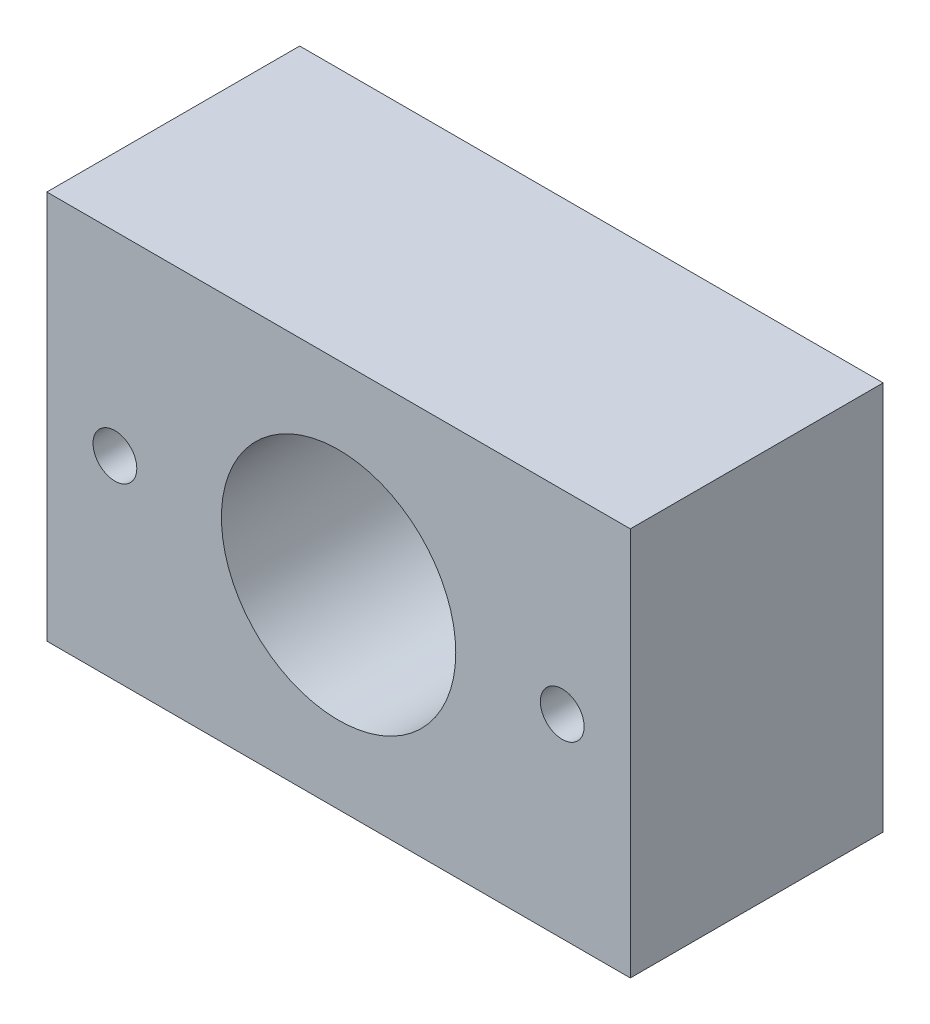
ISO-10303-21;
HEADER;
FILE_DESCRIPTION(('STEP AP214'),'2;1');
FILE_NAME('part.step','',(''),(''),'','','');
FILE_SCHEMA(('AUTOMOTIVE_DESIGN { 1 0 10303 214 1 1 1 1 }'));
ENDSEC;
DATA;
#1=APPLICATION_CONTEXT('core data for automotive mechanical design processes');
#2=APPLICATION_PROTOCOL_DEFINITION('international standard','automotive_design',2000,#1);
#3=PRODUCT_CONTEXT('',#1,'mechanical');
#4=PRODUCT('Part','Part','',(#3));
#5=PRODUCT_RELATED_PRODUCT_CATEGORY('part','',(#4));
#6=PRODUCT_DEFINITION_FORMATION('','',#4);
#7=PRODUCT_DEFINITION_CONTEXT('part definition',#1,'design');
#8=PRODUCT_DEFINITION('design','',#6,#7);
#9=PRODUCT_DEFINITION_SHAPE('','',#8);
#10=(LENGTH_UNIT() NAMED_UNIT(*) SI_UNIT(.MILLI.,.METRE.));
#11=(NAMED_UNIT(*) PLANE_ANGLE_UNIT() SI_UNIT($,.RADIAN.));
#12=(NAMED_UNIT(*) SI_UNIT($,.STERADIAN.) SOLID_ANGLE_UNIT());
#13=UNCERTAINTY_MEASURE_WITH_UNIT(LENGTH_MEASURE(1.E-05),#10,'distance_accuracy_value','');
#14=(GEOMETRIC_REPRESENTATION_CONTEXT(3) GLOBAL_UNCERTAINTY_ASSIGNED_CONTEXT((#13)) GLOBAL_UNIT_ASSIGNED_CONTEXT((#10,
#11,#12)) REPRESENTATION_CONTEXT('',''));
#15=CARTESIAN_POINT('',(0.,0.,0.));
#16=DIRECTION('',(0.,0.,1.));
#17=DIRECTION('',(1.,0.,0.));
#18=AXIS2_PLACEMENT_3D('',#15,#16,#17);
#19=CARTESIAN_POINT('',(0.,0.,6.));
#20=DIRECTION('',(0.,0.,1.));
#21=DIRECTION('',(1.,0.,0.));
#22=AXIS2_PLACEMENT_3D('',#19,#20,#21);
#23=PLANE('',#22);
#24=CARTESIAN_POINT('',(0.,0.,6.));
#25=DIRECTION('',(0.,0.,1.));
#26=DIRECTION('',(1.,0.,0.));
#27=AXIS2_PLACEMENT_3D('',#24,#25,#26);
#28=CIRCLE('',#27,9.51);
#29=CARTESIAN_POINT('',(9.51,0.,6.));
#30=VERTEX_POINT('',#29);
#31=EDGE_CURVE('E10',#30,#30,#28,.T.);
#32=ORIENTED_EDGE('',*,*,#31,.F.);
#33=EDGE_LOOP('',(#32));
#34=FACE_BOUND('',#33,.T.);
#35=CARTESIAN_POINT('',(0.,0.,6.));
#36=DIRECTION('',(0.,0.,1.));
#37=DIRECTION('',(1.,0.,0.));
#38=AXIS2_PLACEMENT_3D('',#35,#36,#37);
#39=CIRCLE('',#38,12.05);
#40=CARTESIAN_POINT('',(12.05,0.,6.));
#41=VERTEX_POINT('',#40);
#42=EDGE_CURVE('E20',#41,#41,#39,.T.);
#43=ORIENTED_EDGE('',*,*,#42,.T.);
#44=EDGE_LOOP('',(#43));
#45=FACE_BOUND('',#44,.T.);
#46=ADVANCED_FACE('F16',(#34,#45),#23,.T.);
#47=CARTESIAN_POINT('',(0.,0.,-1.));
#48=DIRECTION('',(0.,0.,1.));
#49=DIRECTION('',(1.,0.,0.));
#50=AXIS2_PLACEMENT_3D('',#47,#48,#49);
#51=CYLINDRICAL_SURFACE('',#50,9.51);
#52=ORIENTED_EDGE('',*,*,#31,.T.);
#53=EDGE_LOOP('',(#52));
#54=FACE_BOUND('',#53,.T.);
#55=CARTESIAN_POINT('',(0.,0.,0.));
#56=DIRECTION('',(0.,0.,1.));
#57=DIRECTION('',(1.,0.,0.));
#58=AXIS2_PLACEMENT_3D('',#55,#56,#57);
#59=CIRCLE('',#58,9.51);
#60=CARTESIAN_POINT('',(9.51,0.,0.));
#61=VERTEX_POINT('',#60);
#62=EDGE_CURVE('E115',#61,#61,#59,.T.);
#63=ORIENTED_EDGE('',*,*,#62,.F.);
#64=EDGE_LOOP('',(#63));
#65=FACE_BOUND('',#64,.T.);
#66=ADVANCED_FACE('F18',(#54,#65),#51,.F.);
#67=CARTESIAN_POINT('',(23.,0.,-1.));
#68=DIRECTION('',(0.,0.,1.));
#69=DIRECTION('',(1.,0.,0.));
#70=AXIS2_PLACEMENT_3D('',#67,#68,#69);
#71=CYLINDRICAL_SURFACE('',#70,2.25);
#72=CARTESIAN_POINT('',(23.,0.,26.));
#73=DIRECTION('',(0.,0.,1.));
#74=DIRECTION('',(1.,0.,0.));
#75=AXIS2_PLACEMENT_3D('',#72,#73,#74);
#76=CIRCLE('',#75,2.25);
#77=CARTESIAN_POINT('',(25.25,0.,26.));
#78=VERTEX_POINT('',#77);
#79=EDGE_CURVE('E94',#78,#78,#76,.T.);
#80=ORIENTED_EDGE('',*,*,#79,.T.);
#81=EDGE_LOOP('',(#80));
#82=FACE_BOUND('',#81,.T.);
#83=CARTESIAN_POINT('',(23.,0.,0.));
#84=DIRECTION('',(0.,0.,1.));
#85=DIRECTION('',(1.,0.,0.));
#86=AXIS2_PLACEMENT_3D('',#83,#84,#85);
#87=CIRCLE('',#86,2.25);
#88=CARTESIAN_POINT('',(25.25,0.,0.));
#89=VERTEX_POINT('',#88);
#90=EDGE_CURVE('E118',#89,#89,#87,.T.);
#91=ORIENTED_EDGE('',*,*,#90,.F.);
#92=EDGE_LOOP('',(#91));
#93=FACE_BOUND('',#92,.T.);
#94=ADVANCED_FACE('F134',(#82,#93),#71,.F.);
#95=CARTESIAN_POINT('',(0.,0.,6.));
#96=DIRECTION('',(0.,0.,1.));
#97=DIRECTION('',(1.,0.,0.));
#98=AXIS2_PLACEMENT_3D('',#95,#96,#97);
#99=CYLINDRICAL_SURFACE('',#98,12.05);
#100=CARTESIAN_POINT('',(0.,0.,26.));
#101=DIRECTION('',(0.,0.,1.));
#102=DIRECTION('',(1.,0.,0.));
#103=AXIS2_PLACEMENT_3D('',#100,#101,#102);
#104=CIRCLE('',#103,12.05);
#105=CARTESIAN_POINT('',(12.05,0.,26.));
#106=VERTEX_POINT('',#105);
#107=EDGE_CURVE('E102',#106,#106,#104,.T.);
#108=ORIENTED_EDGE('',*,*,#107,.T.);
#109=EDGE_LOOP('',(#108));
#110=FACE_BOUND('',#109,.T.);
#111=ORIENTED_EDGE('',*,*,#42,.F.);
#112=EDGE_LOOP('',(#111));
#113=FACE_BOUND('',#112,.T.);
#114=ADVANCED_FACE('F131',(#110,#113),#99,.F.);
#115=CARTESIAN_POINT('',(-23.,0.,-1.));
#116=DIRECTION('',(0.,0.,1.));
#117=DIRECTION('',(1.,0.,0.));
#118=AXIS2_PLACEMENT_3D('',#115,#116,#117);
#119=CYLINDRICAL_SURFACE('',#118,2.25);
#120=CARTESIAN_POINT('',(-23.,0.,26.));
#121=DIRECTION('',(0.,0.,1.));
#122=DIRECTION('',(1.,0.,0.));
#123=AXIS2_PLACEMENT_3D('',#120,#121,#122);
#124=CIRCLE('',#123,2.25);
#125=CARTESIAN_POINT('',(-20.75,0.,26.));
#126=VERTEX_POINT('',#125);
#127=EDGE_CURVE('E98',#126,#126,#124,.T.);
#128=ORIENTED_EDGE('',*,*,#127,.T.);
#129=EDGE_LOOP('',(#128));
#130=FACE_BOUND('',#129,.T.);
#131=CARTESIAN_POINT('',(-23.,0.,0.));
#132=DIRECTION('',(0.,0.,1.));
#133=DIRECTION('',(1.,0.,0.));
#134=AXIS2_PLACEMENT_3D('',#131,#132,#133);
#135=CIRCLE('',#134,2.25);
#136=CARTESIAN_POINT('',(-20.75,0.,0.));
#137=VERTEX_POINT('',#136);
#138=EDGE_CURVE('E114',#137,#137,#135,.T.);
#139=ORIENTED_EDGE('',*,*,#138,.F.);
#140=EDGE_LOOP('',(#139));
#141=FACE_BOUND('',#140,.T.);
#142=ADVANCED_FACE('F133',(#130,#141),#119,.F.);
#143=CARTESIAN_POINT('',(30.,-20.,0.));
#144=DIRECTION('',(1.,0.,0.));
#145=DIRECTION('',(0.,1.,0.));
#146=AXIS2_PLACEMENT_3D('',#143,#144,#145);
#147=PLANE('',#146);
#148=DIRECTION('',(0.,0.,1.));
#149=VECTOR('',#148,1.);
#150=CARTESIAN_POINT('',(30.,-20.,0.));
#151=LINE('',#150,#149);
#152=CARTESIAN_POINT('',(30.,-20.,0.));
#153=VERTEX_POINT('',#152);
#154=CARTESIAN_POINT('',(30.,-20.,26.));
#155=VERTEX_POINT('',#154);
#156=EDGE_CURVE('E60',#153,#155,#151,.T.);
#157=ORIENTED_EDGE('',*,*,#156,.F.);
#158=DIRECTION('',(0.,1.,0.));
#159=VECTOR('',#158,1.);
#160=CARTESIAN_POINT('',(30.,-20.,0.));
#161=LINE('',#160,#159);
#162=CARTESIAN_POINT('',(30.,20.,0.));
#163=VERTEX_POINT('',#162);
#164=EDGE_CURVE('E39',#153,#163,#161,.T.);
#165=ORIENTED_EDGE('',*,*,#164,.T.);
#166=DIRECTION('',(0.,0.,1.));
#167=VECTOR('',#166,1.);
#168=CARTESIAN_POINT('',(30.,20.,0.));
#169=LINE('',#168,#167);
#170=CARTESIAN_POINT('',(30.,20.,26.));
#171=VERTEX_POINT('',#170);
#172=EDGE_CURVE('E61',#163,#171,#169,.T.);
#173=ORIENTED_EDGE('',*,*,#172,.T.);
#174=DIRECTION('',(0.,1.,0.));
#175=VECTOR('',#174,1.);
#176=CARTESIAN_POINT('',(30.,-20.,26.));
#177=LINE('',#176,#175);
#178=EDGE_CURVE('E56',#155,#171,#177,.T.);
#179=ORIENTED_EDGE('',*,*,#178,.F.);
#180=EDGE_LOOP('',(#157,#165,#173,#179));
#181=FACE_BOUND('',#180,.T.);
#182=ADVANCED_FACE('F58',(#181),#147,.T.);
#183=CARTESIAN_POINT('',(-30.,-20.,0.));
#184=DIRECTION('',(0.,0.,1.));
#185=DIRECTION('',(1.,0.,0.));
#186=AXIS2_PLACEMENT_3D('',#183,#184,#185);
#187=PLANE('',#186);
#188=ORIENTED_EDGE('',*,*,#90,.T.);
#189=EDGE_LOOP('',(#188));
#190=FACE_BOUND('',#189,.T.);
#191=ORIENTED_EDGE('',*,*,#62,.T.);
#192=EDGE_LOOP('',(#191));
#193=FACE_BOUND('',#192,.T.);
#194=ORIENTED_EDGE('',*,*,#138,.T.);
#195=EDGE_LOOP('',(#194));
#196=FACE_BOUND('',#195,.T.);
#197=DIRECTION('',(1.,0.,0.));
#198=VECTOR('',#197,1.);
#199=CARTESIAN_POINT('',(-30.,20.,0.));
#200=LINE('',#199,#198);
#201=CARTESIAN_POINT('',(-30.,20.,0.));
#202=VERTEX_POINT('',#201);
#203=EDGE_CURVE('E106',#202,#163,#200,.T.);
#204=ORIENTED_EDGE('',*,*,#203,.T.);
#205=ORIENTED_EDGE('',*,*,#164,.F.);
#206=DIRECTION('',(1.,0.,0.));
#207=VECTOR('',#206,1.);
#208=CARTESIAN_POINT('',(-30.,-20.,0.));
#209=LINE('',#208,#207);
#210=CARTESIAN_POINT('',(-30.,-20.,0.));
#211=VERTEX_POINT('',#210);
#212=EDGE_CURVE('E67',#211,#153,#209,.T.);
#213=ORIENTED_EDGE('',*,*,#212,.F.);
#214=DIRECTION('',(0.,1.,0.));
#215=VECTOR('',#214,1.);
#216=CARTESIAN_POINT('',(-30.,-20.,0.));
#217=LINE('',#216,#215);
#218=EDGE_CURVE('E90',#211,#202,#217,.T.);
#219=ORIENTED_EDGE('',*,*,#218,.T.);
#220=EDGE_LOOP('',(#204,#205,#213,#219));
#221=FACE_BOUND('',#220,.T.);
#222=ADVANCED_FACE('F157',(#190,#193,#196,#221),#187,.F.);
#223=CARTESIAN_POINT('',(-30.,20.,0.));
#224=DIRECTION('',(0.,1.,0.));
#225=DIRECTION('',(1.,0.,0.));
#226=AXIS2_PLACEMENT_3D('',#223,#224,#225);
#227=PLANE('',#226);
#228=ORIENTED_EDGE('',*,*,#203,.F.);
#229=DIRECTION('',(0.,0.,1.));
#230=VECTOR('',#229,1.);
#231=CARTESIAN_POINT('',(-30.,20.,0.));
#232=LINE('',#231,#230);
#233=CARTESIAN_POINT('',(-30.,20.,26.));
#234=VERTEX_POINT('',#233);
#235=EDGE_CURVE('E180',#202,#234,#232,.T.);
#236=ORIENTED_EDGE('',*,*,#235,.T.);
#237=DIRECTION('',(1.,0.,0.));
#238=VECTOR('',#237,1.);
#239=CARTESIAN_POINT('',(-30.,20.,26.));
#240=LINE('',#239,#238);
#241=EDGE_CURVE('E66',#234,#171,#240,.T.);
#242=ORIENTED_EDGE('',*,*,#241,.T.);
#243=ORIENTED_EDGE('',*,*,#172,.F.);
#244=EDGE_LOOP('',(#228,#236,#242,#243));
#245=FACE_BOUND('',#244,.T.);
#246=ADVANCED_FACE('F163',(#245),#227,.T.);
#247=CARTESIAN_POINT('',(-30.,-20.,26.));
#248=DIRECTION('',(0.,0.,1.));
#249=DIRECTION('',(1.,0.,0.));
#250=AXIS2_PLACEMENT_3D('',#247,#248,#249);
#251=PLANE('',#250);
#252=ORIENTED_EDGE('',*,*,#79,.F.);
#253=EDGE_LOOP('',(#252));
#254=FACE_BOUND('',#253,.T.);
#255=ORIENTED_EDGE('',*,*,#107,.F.);
#256=EDGE_LOOP('',(#255));
#257=FACE_BOUND('',#256,.T.);
#258=ORIENTED_EDGE('',*,*,#127,.F.);
#259=EDGE_LOOP('',(#258));
#260=FACE_BOUND('',#259,.T.);
#261=DIRECTION('',(0.,1.,0.));
#262=VECTOR('',#261,1.);
#263=CARTESIAN_POINT('',(-30.,-20.,26.));
#264=LINE('',#263,#262);
#265=CARTESIAN_POINT('',(-30.,-20.,26.));
#266=VERTEX_POINT('',#265);
#267=EDGE_CURVE('E75',#266,#234,#264,.T.);
#268=ORIENTED_EDGE('',*,*,#267,.F.);
#269=DIRECTION('',(1.,0.,0.));
#270=VECTOR('',#269,1.);
#271=CARTESIAN_POINT('',(-30.,-20.,26.));
#272=LINE('',#271,#270);
#273=EDGE_CURVE('E71',#266,#155,#272,.T.);
#274=ORIENTED_EDGE('',*,*,#273,.T.);
#275=ORIENTED_EDGE('',*,*,#178,.T.);
#276=ORIENTED_EDGE('',*,*,#241,.F.);
#277=EDGE_LOOP('',(#268,#274,#275,#276));
#278=FACE_BOUND('',#277,.T.);
#279=ADVANCED_FACE('F72',(#254,#257,#260,#278),#251,.T.);
#280=CARTESIAN_POINT('',(-30.,-20.,0.));
#281=DIRECTION('',(0.,1.,0.));
#282=DIRECTION('',(1.,0.,0.));
#283=AXIS2_PLACEMENT_3D('',#280,#281,#282);
#284=PLANE('',#283);
#285=ORIENTED_EDGE('',*,*,#156,.T.);
#286=ORIENTED_EDGE('',*,*,#273,.F.);
#287=DIRECTION('',(0.,0.,1.));
#288=VECTOR('',#287,1.);
#289=CARTESIAN_POINT('',(-30.,-20.,0.));
#290=LINE('',#289,#288);
#291=EDGE_CURVE('E84',#211,#266,#290,.T.);
#292=ORIENTED_EDGE('',*,*,#291,.F.);
#293=ORIENTED_EDGE('',*,*,#212,.T.);
#294=EDGE_LOOP('',(#285,#286,#292,#293));
#295=FACE_BOUND('',#294,.T.);
#296=ADVANCED_FACE('F82',(#295),#284,.F.);
#297=CARTESIAN_POINT('',(-30.,-20.,0.));
#298=DIRECTION('',(1.,0.,0.));
#299=DIRECTION('',(0.,1.,0.));
#300=AXIS2_PLACEMENT_3D('',#297,#298,#299);
#301=PLANE('',#300);
#302=ORIENTED_EDGE('',*,*,#267,.T.);
#303=ORIENTED_EDGE('',*,*,#235,.F.);
#304=ORIENTED_EDGE('',*,*,#218,.F.);
#305=ORIENTED_EDGE('',*,*,#291,.T.);
#306=EDGE_LOOP('',(#302,#303,#304,#305));
#307=FACE_BOUND('',#306,.T.);
#308=ADVANCED_FACE('F235',(#307),#301,.F.);
#309=CLOSED_SHELL('',(#46,#66,#94,#114,#142,#182,#222,#246,#279,#296,#308));
#310=MANIFOLD_SOLID_BREP('B1',#309);
#311=ADVANCED_BREP_SHAPE_REPRESENTATION('',(#18,#310),#14);
#312=SHAPE_DEFINITION_REPRESENTATION(#9,#311);
ENDSEC;
END-ISO-10303-21;
